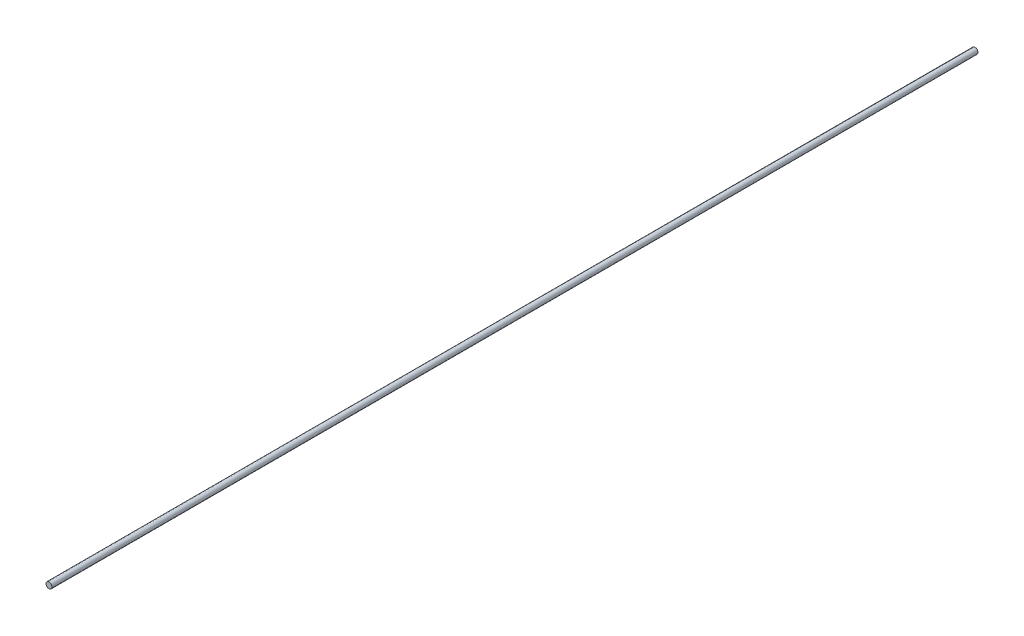
ISO-10303-21;
HEADER;
FILE_DESCRIPTION(('STEP AP214'),'2;1');
FILE_NAME('part.step','',(''),(''),'','','');
FILE_SCHEMA(('AUTOMOTIVE_DESIGN { 1 0 10303 214 1 1 1 1 }'));
ENDSEC;
DATA;
#1=APPLICATION_CONTEXT('core data for automotive mechanical design processes');
#2=APPLICATION_PROTOCOL_DEFINITION('international standard','automotive_design',2000,#1);
#3=PRODUCT_CONTEXT('',#1,'mechanical');
#4=PRODUCT('Part','Part','',(#3));
#5=PRODUCT_RELATED_PRODUCT_CATEGORY('part','',(#4));
#6=PRODUCT_DEFINITION_FORMATION('','',#4);
#7=PRODUCT_DEFINITION_CONTEXT('part definition',#1,'design');
#8=PRODUCT_DEFINITION('design','',#6,#7);
#9=PRODUCT_DEFINITION_SHAPE('','',#8);
#10=(LENGTH_UNIT() NAMED_UNIT(*) SI_UNIT(.MILLI.,.METRE.));
#11=(NAMED_UNIT(*) PLANE_ANGLE_UNIT() SI_UNIT($,.RADIAN.));
#12=(NAMED_UNIT(*) SI_UNIT($,.STERADIAN.) SOLID_ANGLE_UNIT());
#13=UNCERTAINTY_MEASURE_WITH_UNIT(LENGTH_MEASURE(1.E-05),#10,'distance_accuracy_value','');
#14=(GEOMETRIC_REPRESENTATION_CONTEXT(3) GLOBAL_UNCERTAINTY_ASSIGNED_CONTEXT((#13)) GLOBAL_UNIT_ASSIGNED_CONTEXT((#10,
#11,#12)) REPRESENTATION_CONTEXT('',''));
#15=CARTESIAN_POINT('',(0.,0.,0.));
#16=DIRECTION('',(0.,0.,1.));
#17=DIRECTION('',(1.,0.,0.));
#18=AXIS2_PLACEMENT_3D('',#15,#16,#17);
#19=CARTESIAN_POINT('',(0.,0.,990.6));
#20=DIRECTION('',(0.,0.,-1.));
#21=DIRECTION('',(-1.,0.,0.));
#22=AXIS2_PLACEMENT_3D('',#19,#20,#21);
#23=CYLINDRICAL_SURFACE('',#22,3.175);
#24=CARTESIAN_POINT('',(0.,0.,990.6));
#25=DIRECTION('',(0.,0.,1.));
#26=DIRECTION('',(1.,0.,0.));
#27=AXIS2_PLACEMENT_3D('',#24,#25,#26);
#28=CIRCLE('',#27,3.175);
#29=CARTESIAN_POINT('',(3.175,0.,990.6));
#30=VERTEX_POINT('',#29);
#31=EDGE_CURVE('E10',#30,#30,#28,.T.);
#32=ORIENTED_EDGE('',*,*,#31,.F.);
#33=EDGE_LOOP('',(#32));
#34=FACE_BOUND('',#33,.T.);
#35=CARTESIAN_POINT('',(0.,0.,0.));
#36=DIRECTION('',(0.,0.,1.));
#37=DIRECTION('',(1.,0.,0.));
#38=AXIS2_PLACEMENT_3D('',#35,#36,#37);
#39=CIRCLE('',#38,3.175);
#40=CARTESIAN_POINT('',(3.175,0.,0.));
#41=VERTEX_POINT('',#40);
#42=EDGE_CURVE('E34',#41,#41,#39,.T.);
#43=ORIENTED_EDGE('',*,*,#42,.T.);
#44=EDGE_LOOP('',(#43));
#45=FACE_BOUND('',#44,.T.);
#46=ADVANCED_FACE('F31',(#34,#45),#23,.T.);
#47=CARTESIAN_POINT('',(0.,0.,990.6));
#48=DIRECTION('',(0.,0.,1.));
#49=DIRECTION('',(1.,0.,0.));
#50=AXIS2_PLACEMENT_3D('',#47,#48,#49);
#51=PLANE('',#50);
#52=ORIENTED_EDGE('',*,*,#31,.T.);
#53=EDGE_LOOP('',(#52));
#54=FACE_BOUND('',#53,.T.);
#55=ADVANCED_FACE('F46',(#54),#51,.T.);
#56=CARTESIAN_POINT('',(0.,0.,0.));
#57=DIRECTION('',(0.,0.,1.));
#58=DIRECTION('',(1.,0.,0.));
#59=AXIS2_PLACEMENT_3D('',#56,#57,#58);
#60=PLANE('',#59);
#61=ORIENTED_EDGE('',*,*,#42,.F.);
#62=EDGE_LOOP('',(#61));
#63=FACE_BOUND('',#62,.T.);
#64=ADVANCED_FACE('F44',(#63),#60,.F.);
#65=CLOSED_SHELL('',(#46,#55,#64));
#66=MANIFOLD_SOLID_BREP('B2',#65);
#67=ADVANCED_BREP_SHAPE_REPRESENTATION('',(#18,#66),#14);
#68=SHAPE_DEFINITION_REPRESENTATION(#9,#67);
ENDSEC;
END-ISO-10303-21;
